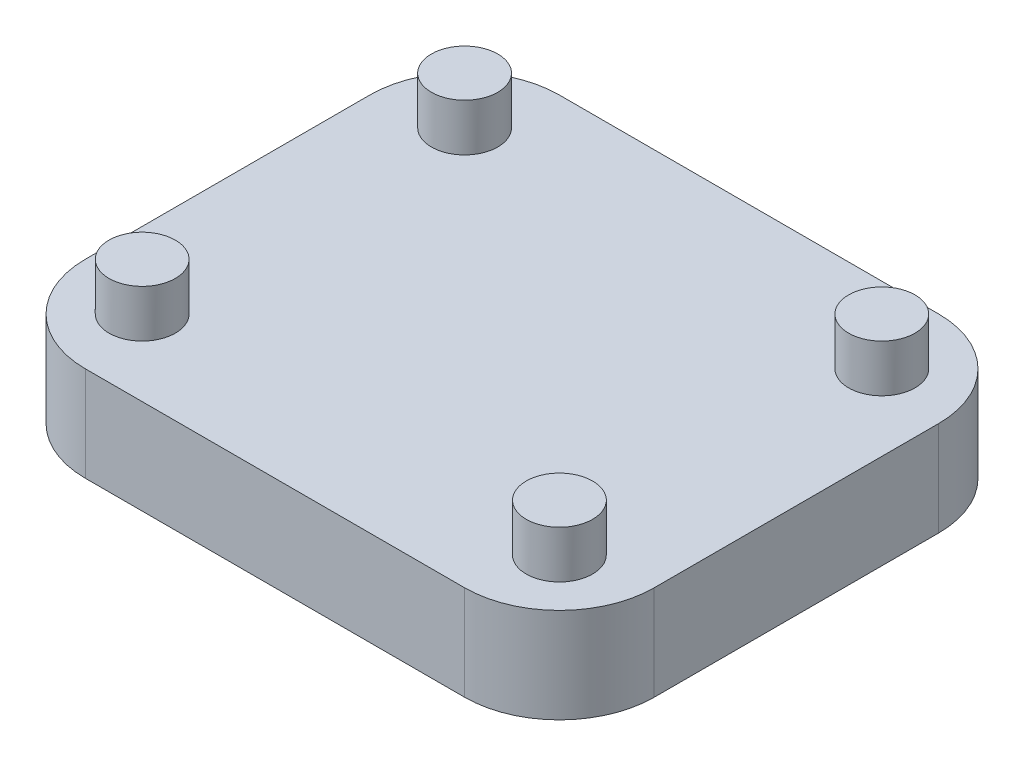
ISO-10303-21;
HEADER;
FILE_DESCRIPTION(('STEP AP214'),'2;1');
FILE_NAME('part.step','',(''),(''),'','','');
FILE_SCHEMA(('AUTOMOTIVE_DESIGN { 1 0 10303 214 1 1 1 1 }'));
ENDSEC;
DATA;
#1=APPLICATION_CONTEXT('core data for automotive mechanical design processes');
#2=APPLICATION_PROTOCOL_DEFINITION('international standard','automotive_design',2000,#1);
#3=PRODUCT_CONTEXT('',#1,'mechanical');
#4=PRODUCT('Part','Part','',(#3));
#5=PRODUCT_RELATED_PRODUCT_CATEGORY('part','',(#4));
#6=PRODUCT_DEFINITION_FORMATION('','',#4);
#7=PRODUCT_DEFINITION_CONTEXT('part definition',#1,'design');
#8=PRODUCT_DEFINITION('design','',#6,#7);
#9=PRODUCT_DEFINITION_SHAPE('','',#8);
#10=(LENGTH_UNIT() NAMED_UNIT(*) SI_UNIT(.MILLI.,.METRE.));
#11=(NAMED_UNIT(*) PLANE_ANGLE_UNIT() SI_UNIT($,.RADIAN.));
#12=(NAMED_UNIT(*) SI_UNIT($,.STERADIAN.) SOLID_ANGLE_UNIT());
#13=UNCERTAINTY_MEASURE_WITH_UNIT(LENGTH_MEASURE(1.E-05),#10,'distance_accuracy_value','');
#14=(GEOMETRIC_REPRESENTATION_CONTEXT(3) GLOBAL_UNCERTAINTY_ASSIGNED_CONTEXT((#13)) GLOBAL_UNIT_ASSIGNED_CONTEXT((#10,
#11,#12)) REPRESENTATION_CONTEXT('',''));
#15=CARTESIAN_POINT('',(0.,0.,0.));
#16=DIRECTION('',(0.,0.,1.));
#17=DIRECTION('',(1.,0.,0.));
#18=AXIS2_PLACEMENT_3D('',#15,#16,#17);
#19=CARTESIAN_POINT('',(-2.,2.,2.));
#20=DIRECTION('',(0.,-1.,0.));
#21=DIRECTION('',(0.,0.,-1.));
#22=AXIS2_PLACEMENT_3D('',#19,#20,#21);
#23=CYLINDRICAL_SURFACE('',#22,2.);
#24=CARTESIAN_POINT('',(-2.,0.,2.));
#25=DIRECTION('',(0.,1.,0.));
#26=DIRECTION('',(0.,0.,-1.));
#27=AXIS2_PLACEMENT_3D('',#24,#25,#26);
#28=CIRCLE('',#27,2.);
#29=CARTESIAN_POINT('',(0.,0.,2.00000000000001));
#30=VERTEX_POINT('',#29);
#31=CARTESIAN_POINT('',(-2.00000000000001,0.,0.));
#32=VERTEX_POINT('',#31);
#33=EDGE_CURVE('E130',#30,#32,#28,.T.);
#34=ORIENTED_EDGE('',*,*,#33,.T.);
#35=DIRECTION('',(0.,-1.,0.));
#36=VECTOR('',#35,1.);
#37=CARTESIAN_POINT('',(-2.00000000000001,2.,0.));
#38=LINE('',#37,#36);
#39=CARTESIAN_POINT('',(-2.00000000000001,2.,0.));
#40=VERTEX_POINT('',#39);
#41=EDGE_CURVE('E158',#40,#32,#38,.T.);
#42=ORIENTED_EDGE('',*,*,#41,.F.);
#43=CARTESIAN_POINT('',(-2.,2.,2.));
#44=DIRECTION('',(0.,1.,0.));
#45=DIRECTION('',(0.,0.,-1.));
#46=AXIS2_PLACEMENT_3D('',#43,#44,#45);
#47=CIRCLE('',#46,2.);
#48=CARTESIAN_POINT('',(0.,2.,2.00000000000001));
#49=VERTEX_POINT('',#48);
#50=EDGE_CURVE('E145',#49,#40,#47,.T.);
#51=ORIENTED_EDGE('',*,*,#50,.F.);
#52=DIRECTION('',(0.,-1.,0.));
#53=VECTOR('',#52,1.);
#54=CARTESIAN_POINT('',(0.,2.,2.00000000000001));
#55=LINE('',#54,#53);
#56=EDGE_CURVE('E126',#49,#30,#55,.T.);
#57=ORIENTED_EDGE('',*,*,#56,.T.);
#58=EDGE_LOOP('',(#34,#42,#51,#57));
#59=FACE_BOUND('',#58,.T.);
#60=ADVANCED_FACE('F33',(#59),#23,.T.);
#61=CARTESIAN_POINT('',(-2.00000000000001,2.,0.));
#62=DIRECTION('',(0.,0.,1.));
#63=DIRECTION('',(1.,0.,0.));
#64=AXIS2_PLACEMENT_3D('',#61,#62,#63);
#65=PLANE('',#64);
#66=DIRECTION('',(-1.,0.,0.));
#67=VECTOR('',#66,1.);
#68=CARTESIAN_POINT('',(-2.00000000000001,0.,0.));
#69=LINE('',#68,#67);
#70=CARTESIAN_POINT('',(-9.99999999999999,0.,0.));
#71=VERTEX_POINT('',#70);
#72=EDGE_CURVE('E133',#32,#71,#69,.T.);
#73=ORIENTED_EDGE('',*,*,#72,.T.);
#74=DIRECTION('',(0.,-1.,0.));
#75=VECTOR('',#74,1.);
#76=CARTESIAN_POINT('',(-9.99999999999999,2.,0.));
#77=LINE('',#76,#75);
#78=CARTESIAN_POINT('',(-9.99999999999999,2.,0.));
#79=VERTEX_POINT('',#78);
#80=EDGE_CURVE('E155',#79,#71,#77,.T.);
#81=ORIENTED_EDGE('',*,*,#80,.F.);
#82=DIRECTION('',(-1.,0.,0.));
#83=VECTOR('',#82,1.);
#84=CARTESIAN_POINT('',(-2.00000000000001,2.,0.));
#85=LINE('',#84,#83);
#86=EDGE_CURVE('E93',#40,#79,#85,.T.);
#87=ORIENTED_EDGE('',*,*,#86,.F.);
#88=ORIENTED_EDGE('',*,*,#41,.T.);
#89=EDGE_LOOP('',(#73,#81,#87,#88));
#90=FACE_BOUND('',#89,.T.);
#91=ADVANCED_FACE('F196',(#90),#65,.F.);
#92=CARTESIAN_POINT('',(-10.,2.,2.));
#93=DIRECTION('',(0.,-1.,0.));
#94=DIRECTION('',(0.,0.,-1.));
#95=AXIS2_PLACEMENT_3D('',#92,#93,#94);
#96=CYLINDRICAL_SURFACE('',#95,2.);
#97=CARTESIAN_POINT('',(-10.,0.,2.));
#98=DIRECTION('',(0.,1.,0.));
#99=DIRECTION('',(0.,0.,1.));
#100=AXIS2_PLACEMENT_3D('',#97,#98,#99);
#101=CIRCLE('',#100,2.);
#102=CARTESIAN_POINT('',(-12.,0.,2.00000000000001));
#103=VERTEX_POINT('',#102);
#104=EDGE_CURVE('E136',#71,#103,#101,.T.);
#105=ORIENTED_EDGE('',*,*,#104,.T.);
#106=DIRECTION('',(0.,-1.,0.));
#107=VECTOR('',#106,1.);
#108=CARTESIAN_POINT('',(-12.,2.,2.00000000000001));
#109=LINE('',#108,#107);
#110=CARTESIAN_POINT('',(-12.,2.,2.00000000000001));
#111=VERTEX_POINT('',#110);
#112=EDGE_CURVE('E152',#111,#103,#109,.T.);
#113=ORIENTED_EDGE('',*,*,#112,.F.);
#114=CARTESIAN_POINT('',(-10.,2.,2.));
#115=DIRECTION('',(0.,1.,0.));
#116=DIRECTION('',(0.,0.,1.));
#117=AXIS2_PLACEMENT_3D('',#114,#115,#116);
#118=CIRCLE('',#117,2.);
#119=EDGE_CURVE('E210',#79,#111,#118,.T.);
#120=ORIENTED_EDGE('',*,*,#119,.F.);
#121=ORIENTED_EDGE('',*,*,#80,.T.);
#122=EDGE_LOOP('',(#105,#113,#120,#121));
#123=FACE_BOUND('',#122,.T.);
#124=ADVANCED_FACE('F201',(#123),#96,.T.);
#125=CARTESIAN_POINT('',(-12.,2.,2.00000000000002));
#126=DIRECTION('',(1.,0.,0.));
#127=DIRECTION('',(0.,0.,-1.));
#128=AXIS2_PLACEMENT_3D('',#125,#126,#127);
#129=PLANE('',#128);
#130=DIRECTION('',(0.,0.,1.));
#131=VECTOR('',#130,1.);
#132=CARTESIAN_POINT('',(-12.,0.,2.00000000000002));
#133=LINE('',#132,#131);
#134=CARTESIAN_POINT('',(-12.,0.,7.99999999999999));
#135=VERTEX_POINT('',#134);
#136=EDGE_CURVE('E138',#103,#135,#133,.T.);
#137=ORIENTED_EDGE('',*,*,#136,.T.);
#138=DIRECTION('',(0.,-1.,0.));
#139=VECTOR('',#138,1.);
#140=CARTESIAN_POINT('',(-12.,2.,7.99999999999999));
#141=LINE('',#140,#139);
#142=CARTESIAN_POINT('',(-12.,2.,7.99999999999999));
#143=VERTEX_POINT('',#142);
#144=EDGE_CURVE('E149',#143,#135,#141,.T.);
#145=ORIENTED_EDGE('',*,*,#144,.F.);
#146=DIRECTION('',(0.,0.,1.));
#147=VECTOR('',#146,1.);
#148=CARTESIAN_POINT('',(-12.,2.,2.00000000000002));
#149=LINE('',#148,#147);
#150=EDGE_CURVE('E212',#111,#143,#149,.T.);
#151=ORIENTED_EDGE('',*,*,#150,.F.);
#152=ORIENTED_EDGE('',*,*,#112,.T.);
#153=EDGE_LOOP('',(#137,#145,#151,#152));
#154=FACE_BOUND('',#153,.T.);
#155=ADVANCED_FACE('F339',(#154),#129,.F.);
#156=CARTESIAN_POINT('',(-10.,2.,8.));
#157=DIRECTION('',(0.,-1.,0.));
#158=DIRECTION('',(0.,0.,-1.));
#159=AXIS2_PLACEMENT_3D('',#156,#157,#158);
#160=CYLINDRICAL_SURFACE('',#159,2.);
#161=CARTESIAN_POINT('',(-10.,0.,8.));
#162=DIRECTION('',(0.,1.,0.));
#163=DIRECTION('',(0.,0.,-1.));
#164=AXIS2_PLACEMENT_3D('',#161,#162,#163);
#165=CIRCLE('',#164,2.);
#166=CARTESIAN_POINT('',(-9.99999999999998,0.,10.));
#167=VERTEX_POINT('',#166);
#168=EDGE_CURVE('E140',#135,#167,#165,.T.);
#169=ORIENTED_EDGE('',*,*,#168,.T.);
#170=DIRECTION('',(0.,-1.,0.));
#171=VECTOR('',#170,1.);
#172=CARTESIAN_POINT('',(-9.99999999999998,2.,10.));
#173=LINE('',#172,#171);
#174=CARTESIAN_POINT('',(-9.99999999999998,2.,10.));
#175=VERTEX_POINT('',#174);
#176=EDGE_CURVE('E121',#175,#167,#173,.T.);
#177=ORIENTED_EDGE('',*,*,#176,.F.);
#178=CARTESIAN_POINT('',(-10.,2.,8.));
#179=DIRECTION('',(0.,1.,0.));
#180=DIRECTION('',(0.,0.,-1.));
#181=AXIS2_PLACEMENT_3D('',#178,#179,#180);
#182=CIRCLE('',#181,2.);
#183=EDGE_CURVE('E112',#143,#175,#182,.T.);
#184=ORIENTED_EDGE('',*,*,#183,.F.);
#185=ORIENTED_EDGE('',*,*,#144,.T.);
#186=EDGE_LOOP('',(#169,#177,#184,#185));
#187=FACE_BOUND('',#186,.T.);
#188=ADVANCED_FACE('F331',(#187),#160,.T.);
#189=CARTESIAN_POINT('',(-2.00000000000001,2.,10.));
#190=DIRECTION('',(0.,0.,-1.));
#191=DIRECTION('',(-1.,0.,0.));
#192=AXIS2_PLACEMENT_3D('',#189,#190,#191);
#193=PLANE('',#192);
#194=DIRECTION('',(1.,0.,0.));
#195=VECTOR('',#194,1.);
#196=CARTESIAN_POINT('',(-2.00000000000001,0.,10.));
#197=LINE('',#196,#195);
#198=CARTESIAN_POINT('',(-2.00000000000001,0.,10.));
#199=VERTEX_POINT('',#198);
#200=EDGE_CURVE('E120',#167,#199,#197,.T.);
#201=ORIENTED_EDGE('',*,*,#200,.T.);
#202=DIRECTION('',(0.,-1.,0.));
#203=VECTOR('',#202,1.);
#204=CARTESIAN_POINT('',(-2.00000000000001,2.,10.));
#205=LINE('',#204,#203);
#206=CARTESIAN_POINT('',(-2.00000000000001,2.,10.));
#207=VERTEX_POINT('',#206);
#208=EDGE_CURVE('E117',#207,#199,#205,.T.);
#209=ORIENTED_EDGE('',*,*,#208,.F.);
#210=DIRECTION('',(1.,0.,0.));
#211=VECTOR('',#210,1.);
#212=CARTESIAN_POINT('',(-2.00000000000001,2.,10.));
#213=LINE('',#212,#211);
#214=EDGE_CURVE('E106',#175,#207,#213,.T.);
#215=ORIENTED_EDGE('',*,*,#214,.F.);
#216=ORIENTED_EDGE('',*,*,#176,.T.);
#217=EDGE_LOOP('',(#201,#209,#215,#216));
#218=FACE_BOUND('',#217,.T.);
#219=ADVANCED_FACE('F118',(#218),#193,.F.);
#220=CARTESIAN_POINT('',(-2.,2.,8.));
#221=DIRECTION('',(0.,-1.,0.));
#222=DIRECTION('',(0.,0.,-1.));
#223=AXIS2_PLACEMENT_3D('',#220,#221,#222);
#224=CYLINDRICAL_SURFACE('',#223,2.);
#225=CARTESIAN_POINT('',(-2.,0.,8.));
#226=DIRECTION('',(0.,1.,0.));
#227=DIRECTION('',(0.,0.,-1.));
#228=AXIS2_PLACEMENT_3D('',#225,#226,#227);
#229=CIRCLE('',#228,2.);
#230=CARTESIAN_POINT('',(0.,0.,7.99999999999999));
#231=VERTEX_POINT('',#230);
#232=EDGE_CURVE('E78',#199,#231,#229,.T.);
#233=ORIENTED_EDGE('',*,*,#232,.T.);
#234=DIRECTION('',(0.,-1.,0.));
#235=VECTOR('',#234,1.);
#236=CARTESIAN_POINT('',(0.,2.,7.99999999999999));
#237=LINE('',#236,#235);
#238=CARTESIAN_POINT('',(0.,2.,7.99999999999999));
#239=VERTEX_POINT('',#238);
#240=EDGE_CURVE('E122',#239,#231,#237,.T.);
#241=ORIENTED_EDGE('',*,*,#240,.F.);
#242=CARTESIAN_POINT('',(-2.,2.,8.));
#243=DIRECTION('',(0.,1.,0.));
#244=DIRECTION('',(0.,0.,-1.));
#245=AXIS2_PLACEMENT_3D('',#242,#243,#244);
#246=CIRCLE('',#245,2.);
#247=EDGE_CURVE('E110',#207,#239,#246,.T.);
#248=ORIENTED_EDGE('',*,*,#247,.F.);
#249=ORIENTED_EDGE('',*,*,#208,.T.);
#250=EDGE_LOOP('',(#233,#241,#248,#249));
#251=FACE_BOUND('',#250,.T.);
#252=ADVANCED_FACE('F124',(#251),#224,.T.);
#253=CARTESIAN_POINT('',(0.,2.,2.00000000000001));
#254=DIRECTION('',(-1.,0.,0.));
#255=DIRECTION('',(0.,0.,1.));
#256=AXIS2_PLACEMENT_3D('',#253,#254,#255);
#257=PLANE('',#256);
#258=DIRECTION('',(0.,0.,-1.));
#259=VECTOR('',#258,1.);
#260=CARTESIAN_POINT('',(0.,0.,2.00000000000001));
#261=LINE('',#260,#259);
#262=EDGE_CURVE('E84',#231,#30,#261,.T.);
#263=ORIENTED_EDGE('',*,*,#262,.T.);
#264=ORIENTED_EDGE('',*,*,#56,.F.);
#265=DIRECTION('',(0.,0.,-1.));
#266=VECTOR('',#265,1.);
#267=CARTESIAN_POINT('',(0.,2.,2.00000000000001));
#268=LINE('',#267,#266);
#269=EDGE_CURVE('E49',#239,#49,#268,.T.);
#270=ORIENTED_EDGE('',*,*,#269,.F.);
#271=ORIENTED_EDGE('',*,*,#240,.T.);
#272=EDGE_LOOP('',(#263,#264,#270,#271));
#273=FACE_BOUND('',#272,.T.);
#274=ADVANCED_FACE('F173',(#273),#257,.F.);
#275=CARTESIAN_POINT('',(-2.,2.,2.));
#276=DIRECTION('',(0.,-1.,0.));
#277=DIRECTION('',(0.,0.,-1.));
#278=AXIS2_PLACEMENT_3D('',#275,#276,#277);
#279=PLANE('',#278);
#280=CARTESIAN_POINT('',(-10.4,2.,8.4));
#281=DIRECTION('',(0.,-1.,0.));
#282=DIRECTION('',(0.,0.,-1.));
#283=AXIS2_PLACEMENT_3D('',#280,#281,#282);
#284=CIRCLE('',#283,0.699999999999999);
#285=CARTESIAN_POINT('',(-10.4,2.,7.7));
#286=VERTEX_POINT('',#285);
#287=EDGE_CURVE('E11',#286,#286,#284,.F.);
#288=ORIENTED_EDGE('',*,*,#287,.F.);
#289=EDGE_LOOP('',(#288));
#290=FACE_BOUND('',#289,.T.);
#291=CARTESIAN_POINT('',(-1.6,2.,8.4));
#292=DIRECTION('',(0.,-1.,0.));
#293=DIRECTION('',(0.,0.,-1.));
#294=AXIS2_PLACEMENT_3D('',#291,#292,#293);
#295=CIRCLE('',#294,0.699999999999999);
#296=CARTESIAN_POINT('',(-1.6,2.,7.7));
#297=VERTEX_POINT('',#296);
#298=EDGE_CURVE('E41',#297,#297,#295,.F.);
#299=ORIENTED_EDGE('',*,*,#298,.F.);
#300=EDGE_LOOP('',(#299));
#301=FACE_BOUND('',#300,.T.);
#302=CARTESIAN_POINT('',(-1.6,2.,1.6));
#303=DIRECTION('',(0.,-1.,0.));
#304=DIRECTION('',(0.,0.,-1.));
#305=AXIS2_PLACEMENT_3D('',#302,#303,#304);
#306=CIRCLE('',#305,0.7);
#307=CARTESIAN_POINT('',(-1.6,2.,0.9));
#308=VERTEX_POINT('',#307);
#309=EDGE_CURVE('E163',#308,#308,#306,.F.);
#310=ORIENTED_EDGE('',*,*,#309,.F.);
#311=EDGE_LOOP('',(#310));
#312=FACE_BOUND('',#311,.T.);
#313=CARTESIAN_POINT('',(-10.4,2.,1.6));
#314=DIRECTION('',(0.,-1.,0.));
#315=DIRECTION('',(0.,0.,-1.));
#316=AXIS2_PLACEMENT_3D('',#313,#314,#315);
#317=CIRCLE('',#316,0.7);
#318=CARTESIAN_POINT('',(-10.4,2.,0.900000000000001));
#319=VERTEX_POINT('',#318);
#320=EDGE_CURVE('E160',#319,#319,#317,.F.);
#321=ORIENTED_EDGE('',*,*,#320,.F.);
#322=EDGE_LOOP('',(#321));
#323=FACE_BOUND('',#322,.T.);
#324=ORIENTED_EDGE('',*,*,#50,.T.);
#325=ORIENTED_EDGE('',*,*,#86,.T.);
#326=ORIENTED_EDGE('',*,*,#119,.T.);
#327=ORIENTED_EDGE('',*,*,#150,.T.);
#328=ORIENTED_EDGE('',*,*,#183,.T.);
#329=ORIENTED_EDGE('',*,*,#214,.T.);
#330=ORIENTED_EDGE('',*,*,#247,.T.);
#331=ORIENTED_EDGE('',*,*,#269,.T.);
#332=EDGE_LOOP('',(#324,#325,#326,#327,#328,#329,#330,#331));
#333=FACE_BOUND('',#332,.T.);
#334=ADVANCED_FACE('F108',(#290,#301,#312,#323,#333),#279,.F.);
#335=CARTESIAN_POINT('',(-2.,0.,2.));
#336=DIRECTION('',(0.,-1.,0.));
#337=DIRECTION('',(0.,0.,-1.));
#338=AXIS2_PLACEMENT_3D('',#335,#336,#337);
#339=PLANE('',#338);
#340=ORIENTED_EDGE('',*,*,#33,.F.);
#341=ORIENTED_EDGE('',*,*,#262,.F.);
#342=ORIENTED_EDGE('',*,*,#232,.F.);
#343=ORIENTED_EDGE('',*,*,#200,.F.);
#344=ORIENTED_EDGE('',*,*,#168,.F.);
#345=ORIENTED_EDGE('',*,*,#136,.F.);
#346=ORIENTED_EDGE('',*,*,#104,.F.);
#347=ORIENTED_EDGE('',*,*,#72,.F.);
#348=EDGE_LOOP('',(#340,#341,#342,#343,#344,#345,#346,#347));
#349=FACE_BOUND('',#348,.T.);
#350=ADVANCED_FACE('F172',(#349),#339,.T.);
#351=CARTESIAN_POINT('',(-10.4,3.,1.6));
#352=DIRECTION('',(0.,-1.,0.));
#353=DIRECTION('',(0.,0.,-1.));
#354=AXIS2_PLACEMENT_3D('',#351,#352,#353);
#355=CYLINDRICAL_SURFACE('',#354,0.7);
#356=CARTESIAN_POINT('',(-10.4,3.,1.6));
#357=DIRECTION('',(0.,1.,0.));
#358=DIRECTION('',(0.,0.,1.));
#359=AXIS2_PLACEMENT_3D('',#356,#357,#358);
#360=CIRCLE('',#359,0.7);
#361=CARTESIAN_POINT('',(-10.4,3.,2.3));
#362=VERTEX_POINT('',#361);
#363=EDGE_CURVE('E134',#362,#362,#360,.T.);
#364=ORIENTED_EDGE('',*,*,#363,.F.);
#365=EDGE_LOOP('',(#364));
#366=FACE_BOUND('',#365,.T.);
#367=ORIENTED_EDGE('',*,*,#320,.T.);
#368=EDGE_LOOP('',(#367));
#369=FACE_BOUND('',#368,.T.);
#370=ADVANCED_FACE('F180',(#366,#369),#355,.T.);
#371=CARTESIAN_POINT('',(-10.4,3.,1.6));
#372=DIRECTION('',(0.,1.,0.));
#373=DIRECTION('',(0.,0.,1.));
#374=AXIS2_PLACEMENT_3D('',#371,#372,#373);
#375=PLANE('',#374);
#376=ORIENTED_EDGE('',*,*,#363,.T.);
#377=EDGE_LOOP('',(#376));
#378=FACE_BOUND('',#377,.T.);
#379=ADVANCED_FACE('F182',(#378),#375,.T.);
#380=CARTESIAN_POINT('',(-1.6,3.,1.6));
#381=DIRECTION('',(0.,-1.,0.));
#382=DIRECTION('',(0.,0.,-1.));
#383=AXIS2_PLACEMENT_3D('',#380,#381,#382);
#384=CYLINDRICAL_SURFACE('',#383,0.7);
#385=CARTESIAN_POINT('',(-1.6,3.,1.6));
#386=DIRECTION('',(0.,1.,0.));
#387=DIRECTION('',(0.,0.,1.));
#388=AXIS2_PLACEMENT_3D('',#385,#386,#387);
#389=CIRCLE('',#388,0.7);
#390=CARTESIAN_POINT('',(-1.6,3.,2.3));
#391=VERTEX_POINT('',#390);
#392=EDGE_CURVE('E220',#391,#391,#389,.T.);
#393=ORIENTED_EDGE('',*,*,#392,.F.);
#394=EDGE_LOOP('',(#393));
#395=FACE_BOUND('',#394,.T.);
#396=ORIENTED_EDGE('',*,*,#309,.T.);
#397=EDGE_LOOP('',(#396));
#398=FACE_BOUND('',#397,.T.);
#399=ADVANCED_FACE('F189',(#395,#398),#384,.T.);
#400=CARTESIAN_POINT('',(-1.6,3.,1.6));
#401=DIRECTION('',(0.,1.,0.));
#402=DIRECTION('',(0.,0.,1.));
#403=AXIS2_PLACEMENT_3D('',#400,#401,#402);
#404=PLANE('',#403);
#405=ORIENTED_EDGE('',*,*,#392,.T.);
#406=EDGE_LOOP('',(#405));
#407=FACE_BOUND('',#406,.T.);
#408=ADVANCED_FACE('F248',(#407),#404,.T.);
#409=CARTESIAN_POINT('',(-1.6,3.,8.4));
#410=DIRECTION('',(0.,-1.,0.));
#411=DIRECTION('',(0.,0.,-1.));
#412=AXIS2_PLACEMENT_3D('',#409,#410,#411);
#413=CYLINDRICAL_SURFACE('',#412,0.699999999999999);
#414=CARTESIAN_POINT('',(-1.6,3.,8.4));
#415=DIRECTION('',(0.,1.,0.));
#416=DIRECTION('',(0.,0.,1.));
#417=AXIS2_PLACEMENT_3D('',#414,#415,#416);
#418=CIRCLE('',#417,0.699999999999999);
#419=CARTESIAN_POINT('',(-1.6,3.,9.1));
#420=VERTEX_POINT('',#419);
#421=EDGE_CURVE('E223',#420,#420,#418,.T.);
#422=ORIENTED_EDGE('',*,*,#421,.F.);
#423=EDGE_LOOP('',(#422));
#424=FACE_BOUND('',#423,.T.);
#425=ORIENTED_EDGE('',*,*,#298,.T.);
#426=EDGE_LOOP('',(#425));
#427=FACE_BOUND('',#426,.T.);
#428=ADVANCED_FACE('F168',(#424,#427),#413,.T.);
#429=CARTESIAN_POINT('',(-1.6,3.,8.4));
#430=DIRECTION('',(0.,1.,0.));
#431=DIRECTION('',(0.,0.,1.));
#432=AXIS2_PLACEMENT_3D('',#429,#430,#431);
#433=PLANE('',#432);
#434=ORIENTED_EDGE('',*,*,#421,.T.);
#435=EDGE_LOOP('',(#434));
#436=FACE_BOUND('',#435,.T.);
#437=ADVANCED_FACE('F235',(#436),#433,.T.);
#438=CARTESIAN_POINT('',(-10.4,3.,8.4));
#439=DIRECTION('',(0.,-1.,0.));
#440=DIRECTION('',(0.,0.,-1.));
#441=AXIS2_PLACEMENT_3D('',#438,#439,#440);
#442=CYLINDRICAL_SURFACE('',#441,0.699999999999999);
#443=CARTESIAN_POINT('',(-10.4,3.,8.4));
#444=DIRECTION('',(0.,1.,0.));
#445=DIRECTION('',(0.,0.,1.));
#446=AXIS2_PLACEMENT_3D('',#443,#444,#445);
#447=CIRCLE('',#446,0.699999999999999);
#448=CARTESIAN_POINT('',(-10.4,3.,9.1));
#449=VERTEX_POINT('',#448);
#450=EDGE_CURVE('E226',#449,#449,#447,.T.);
#451=ORIENTED_EDGE('',*,*,#450,.F.);
#452=EDGE_LOOP('',(#451));
#453=FACE_BOUND('',#452,.T.);
#454=ORIENTED_EDGE('',*,*,#287,.T.);
#455=EDGE_LOOP('',(#454));
#456=FACE_BOUND('',#455,.T.);
#457=ADVANCED_FACE('F232',(#453,#456),#442,.T.);
#458=CARTESIAN_POINT('',(-10.4,3.,8.4));
#459=DIRECTION('',(0.,1.,0.));
#460=DIRECTION('',(0.,0.,1.));
#461=AXIS2_PLACEMENT_3D('',#458,#459,#460);
#462=PLANE('',#461);
#463=ORIENTED_EDGE('',*,*,#450,.T.);
#464=EDGE_LOOP('',(#463));
#465=FACE_BOUND('',#464,.T.);
#466=ADVANCED_FACE('F230',(#465),#462,.T.);
#467=CLOSED_SHELL('',(#60,#91,#124,#155,#188,#219,#252,#274,#334,#350,#370,#379,#399,#408,#428,
#437,#457,#466));
#468=MANIFOLD_SOLID_BREP('B2',#467);
#469=ADVANCED_BREP_SHAPE_REPRESENTATION('',(#18,#468),#14);
#470=SHAPE_DEFINITION_REPRESENTATION(#9,#469);
ENDSEC;
END-ISO-10303-21;
